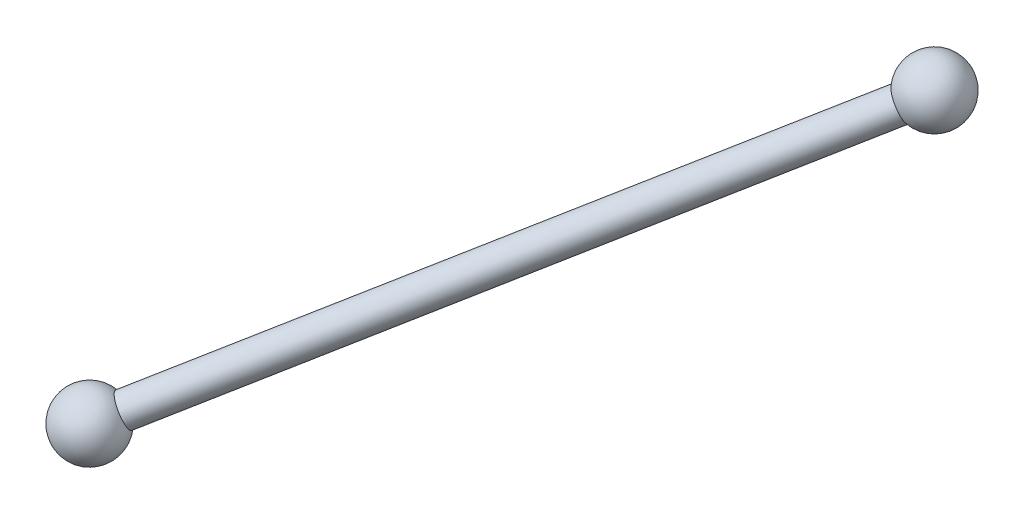
ISO-10303-21;
HEADER;
FILE_DESCRIPTION(('STEP AP214'),'2;1');
FILE_NAME('part.step','',(''),(''),'','','');
FILE_SCHEMA(('AUTOMOTIVE_DESIGN { 1 0 10303 214 1 1 1 1 }'));
ENDSEC;
DATA;
#1=APPLICATION_CONTEXT('core data for automotive mechanical design processes');
#2=APPLICATION_PROTOCOL_DEFINITION('international standard','automotive_design',2000,#1);
#3=PRODUCT_CONTEXT('',#1,'mechanical');
#4=PRODUCT('Part','Part','',(#3));
#5=PRODUCT_RELATED_PRODUCT_CATEGORY('part','',(#4));
#6=PRODUCT_DEFINITION_FORMATION('','',#4);
#7=PRODUCT_DEFINITION_CONTEXT('part definition',#1,'design');
#8=PRODUCT_DEFINITION('design','',#6,#7);
#9=PRODUCT_DEFINITION_SHAPE('','',#8);
#10=(LENGTH_UNIT() NAMED_UNIT(*) SI_UNIT(.MILLI.,.METRE.));
#11=(NAMED_UNIT(*) PLANE_ANGLE_UNIT() SI_UNIT($,.RADIAN.));
#12=(NAMED_UNIT(*) SI_UNIT($,.STERADIAN.) SOLID_ANGLE_UNIT());
#13=UNCERTAINTY_MEASURE_WITH_UNIT(LENGTH_MEASURE(1.E-05),#10,'distance_accuracy_value','');
#14=(GEOMETRIC_REPRESENTATION_CONTEXT(3) GLOBAL_UNCERTAINTY_ASSIGNED_CONTEXT((#13)) GLOBAL_UNIT_ASSIGNED_CONTEXT((#10,
#11,#12)) REPRESENTATION_CONTEXT('',''));
#15=CARTESIAN_POINT('',(0.,0.,0.));
#16=DIRECTION('',(0.,0.,1.));
#17=DIRECTION('',(1.,0.,0.));
#18=AXIS2_PLACEMENT_3D('',#15,#16,#17);
#19=CARTESIAN_POINT('',(-30.3108891325715,101.00000000034,-14.9999999998891));
#20=DIRECTION('',(0.,0.,-1.));
#21=DIRECTION('',(-1.,0.,0.));
#22=AXIS2_PLACEMENT_3D('',#19,#20,#21);
#23=SPHERICAL_SURFACE('',#22,3.);
#24=CARTESIAN_POINT('',(-30.3108891325715,101.00000000034,-14.9999999998891));
#25=DIRECTION('',(-0.63669384291445,-0.435019425760953,0.636693842914662));
#26=DIRECTION('',(-0.707106781186665,0.,-0.70710678118643));
#27=AXIS2_PLACEMENT_3D('',#24,#25,#26);
#28=SPHERICAL_SURFACE('',#27,3.);
#29=CARTESIAN_POINT('',(-31.9650682597627,99.8697863787939,-13.3458208726975));
#30=DIRECTION('',(-0.636693842914451,-0.435019425760953,0.636693842914663));
#31=DIRECTION('',(-0.707106781186665,0.,-0.70710678118643));
#32=AXIS2_PLACEMENT_3D('',#29,#30,#31);
#33=CIRCLE('',#32,1.50000000000001);
#34=CARTESIAN_POINT('',(-33.0257284315427,99.8697863787939,-14.4064810444771));
#35=VERTEX_POINT('',#34);
#36=EDGE_CURVE('E43',#35,#35,#33,.F.);
#37=ORIENTED_EDGE('',*,*,#36,.T.);
#38=EDGE_LOOP('',(#37));
#39=FACE_BOUND('',#38,.T.);
#40=ADVANCED_FACE('F39',(#39),#28,.T.);
#41=CARTESIAN_POINT('',(-71.29165124598,73.,25.980762113533));
#42=DIRECTION('',(0.,0.,-1.));
#43=DIRECTION('',(-1.,0.,0.));
#44=AXIS2_PLACEMENT_3D('',#41,#42,#43);
#45=SPHERICAL_SURFACE('',#44,3.);
#46=CARTESIAN_POINT('',(-71.29165124598,73.,25.980762113533));
#47=DIRECTION('',(0.636693842914449,0.435019425760953,-0.636693842914663));
#48=DIRECTION('',(0.707106781186666,0.,0.707106781186429));
#49=AXIS2_PLACEMENT_3D('',#46,#47,#48);
#50=SPHERICAL_SURFACE('',#49,3.);
#51=CARTESIAN_POINT('',(-69.6374721187888,74.1302136215461,24.3265829863413));
#52=DIRECTION('',(0.636693842914449,0.435019425760954,-0.636693842914663));
#53=DIRECTION('',(0.707106781186666,0.,0.707106781186429));
#54=AXIS2_PLACEMENT_3D('',#51,#52,#53);
#55=CIRCLE('',#54,1.50000000000001);
#56=CARTESIAN_POINT('',(-68.5768119470088,74.1302136215461,25.387243158121));
#57=VERTEX_POINT('',#56);
#58=EDGE_CURVE('E10',#57,#57,#55,.F.);
#59=ORIENTED_EDGE('',*,*,#58,.T.);
#60=EDGE_LOOP('',(#59));
#61=FACE_BOUND('',#60,.T.);
#62=ADVANCED_FACE('F54',(#61),#50,.T.);
#63=CARTESIAN_POINT('',(-30.3108891325715,101.00000000034,-14.9999999998892));
#64=DIRECTION('',(-0.63669384291445,-0.435019425760951,0.636693842914663));
#65=DIRECTION('',(0.707106781186666,0.,0.707106781186429));
#66=AXIS2_PLACEMENT_3D('',#63,#64,#65);
#67=CYLINDRICAL_SURFACE('',#66,1.50000000000001);
#68=ORIENTED_EDGE('',*,*,#36,.F.);
#69=EDGE_LOOP('',(#68));
#70=FACE_BOUND('',#69,.T.);
#71=ORIENTED_EDGE('',*,*,#58,.F.);
#72=EDGE_LOOP('',(#71));
#73=FACE_BOUND('',#72,.T.);
#74=ADVANCED_FACE('F41',(#70,#73),#67,.T.);
#75=CLOSED_SHELL('',(#40,#62,#74));
#76=MANIFOLD_SOLID_BREP('B2',#75);
#77=ADVANCED_BREP_SHAPE_REPRESENTATION('',(#18,#76),#14);
#78=SHAPE_DEFINITION_REPRESENTATION(#9,#77);
ENDSEC;
END-ISO-10303-21;
